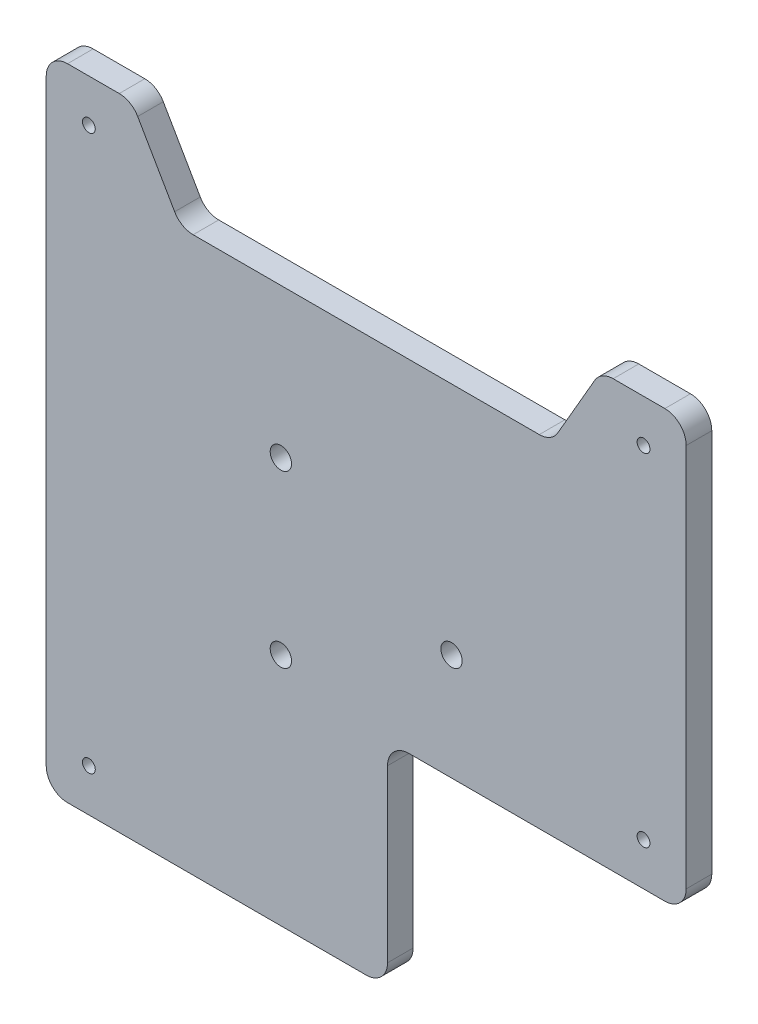
ISO-10303-21;
HEADER;
FILE_DESCRIPTION(('STEP AP214'),'2;1');
FILE_NAME('part.step','',(''),(''),'','','');
FILE_SCHEMA(('AUTOMOTIVE_DESIGN { 1 0 10303 214 1 1 1 1 }'));
ENDSEC;
DATA;
#1=APPLICATION_CONTEXT('core data for automotive mechanical design processes');
#2=APPLICATION_PROTOCOL_DEFINITION('international standard','automotive_design',2000,#1);
#3=PRODUCT_CONTEXT('',#1,'mechanical');
#4=PRODUCT('Part','Part','',(#3));
#5=PRODUCT_RELATED_PRODUCT_CATEGORY('part','',(#4));
#6=PRODUCT_DEFINITION_FORMATION('','',#4);
#7=PRODUCT_DEFINITION_CONTEXT('part definition',#1,'design');
#8=PRODUCT_DEFINITION('design','',#6,#7);
#9=PRODUCT_DEFINITION_SHAPE('','',#8);
#10=(LENGTH_UNIT() NAMED_UNIT(*) SI_UNIT(.MILLI.,.METRE.));
#11=(NAMED_UNIT(*) PLANE_ANGLE_UNIT() SI_UNIT($,.RADIAN.));
#12=(NAMED_UNIT(*) SI_UNIT($,.STERADIAN.) SOLID_ANGLE_UNIT());
#13=UNCERTAINTY_MEASURE_WITH_UNIT(LENGTH_MEASURE(1.E-05),#10,'distance_accuracy_value','');
#14=(GEOMETRIC_REPRESENTATION_CONTEXT(3) GLOBAL_UNCERTAINTY_ASSIGNED_CONTEXT((#13)) GLOBAL_UNIT_ASSIGNED_CONTEXT((#10,
#11,#12)) REPRESENTATION_CONTEXT('',''));
#15=CARTESIAN_POINT('',(0.,0.,0.));
#16=DIRECTION('',(0.,0.,1.));
#17=DIRECTION('',(1.,0.,0.));
#18=AXIS2_PLACEMENT_3D('',#15,#16,#17);
#19=CARTESIAN_POINT('',(-138.750118326392,120.053956834532,6.));
#20=DIRECTION('',(0.,-1.,0.));
#21=DIRECTION('',(0.,0.,-1.));
#22=AXIS2_PLACEMENT_3D('',#19,#20,#21);
#23=PLANE('',#22);
#24=DIRECTION('',(-1.,0.,0.));
#25=VECTOR('',#24,1.);
#26=CARTESIAN_POINT('',(-138.750118326392,120.053956834532,6.));
#27=LINE('',#26,#25);
#28=CARTESIAN_POINT('',(-121.63686967234,120.053956834532,6.));
#29=VERTEX_POINT('',#28);
#30=CARTESIAN_POINT('',(-133.750118326392,120.053956834532,6.));
#31=VERTEX_POINT('',#30);
#32=EDGE_CURVE('E203',#29,#31,#27,.T.);
#33=ORIENTED_EDGE('',*,*,#32,.F.);
#34=DIRECTION('',(0.,0.,1.));
#35=VECTOR('',#34,1.);
#36=CARTESIAN_POINT('',(-121.63686967234,120.053956834532,6.));
#37=LINE('',#36,#35);
#38=CARTESIAN_POINT('',(-121.63686967234,120.053956834532,0.));
#39=VERTEX_POINT('',#38);
#40=EDGE_CURVE('E250',#29,#39,#37,.F.);
#41=ORIENTED_EDGE('',*,*,#40,.T.);
#42=DIRECTION('',(-1.,0.,0.));
#43=VECTOR('',#42,1.);
#44=CARTESIAN_POINT('',(-138.750118326392,120.053956834532,0.));
#45=LINE('',#44,#43);
#46=CARTESIAN_POINT('',(-133.750118326392,120.053956834532,0.));
#47=VERTEX_POINT('',#46);
#48=EDGE_CURVE('E348',#39,#47,#45,.T.);
#49=ORIENTED_EDGE('',*,*,#48,.T.);
#50=DIRECTION('',(0.,0.,-1.));
#51=VECTOR('',#50,1.);
#52=CARTESIAN_POINT('',(-133.750118326392,120.053956834532,6.));
#53=LINE('',#52,#51);
#54=EDGE_CURVE('E248',#47,#31,#53,.F.);
#55=ORIENTED_EDGE('',*,*,#54,.T.);
#56=EDGE_LOOP('',(#33,#41,#49,#55));
#57=FACE_BOUND('',#56,.T.);
#58=ADVANCED_FACE('F35',(#57),#23,.F.);
#59=CARTESIAN_POINT('',(0.,0.,6.));
#60=DIRECTION('',(0.,0.,1.));
#61=DIRECTION('',(1.,0.,0.));
#62=AXIS2_PLACEMENT_3D('',#59,#60,#61);
#63=PLANE('',#62);
#64=CARTESIAN_POINT('',(-128.750118326392,-19.9460431654677,6.));
#65=DIRECTION('',(0.,0.,1.));
#66=DIRECTION('',(1.,0.,0.));
#67=AXIS2_PLACEMENT_3D('',#64,#65,#66);
#68=CIRCLE('',#67,1.5);
#69=CARTESIAN_POINT('',(-127.250118326392,-19.9460431654677,6.));
#70=VERTEX_POINT('',#69);
#71=EDGE_CURVE('E535',#70,#70,#68,.T.);
#72=ORIENTED_EDGE('',*,*,#71,.F.);
#73=EDGE_LOOP('',(#72));
#74=FACE_BOUND('',#73,.T.);
#75=CARTESIAN_POINT('',(-128.750118326392,110.053956834532,6.));
#76=DIRECTION('',(0.,0.,1.));
#77=DIRECTION('',(1.,0.,0.));
#78=AXIS2_PLACEMENT_3D('',#75,#76,#77);
#79=CIRCLE('',#78,1.5);
#80=CARTESIAN_POINT('',(-127.250118326392,110.053956834532,6.));
#81=VERTEX_POINT('',#80);
#82=EDGE_CURVE('E530',#81,#81,#79,.T.);
#83=ORIENTED_EDGE('',*,*,#82,.F.);
#84=EDGE_LOOP('',(#83));
#85=FACE_BOUND('',#84,.T.);
#86=CARTESIAN_POINT('',(1.24988167360846,30.0539568345323,6.));
#87=DIRECTION('',(0.,0.,1.));
#88=DIRECTION('',(1.,0.,0.));
#89=AXIS2_PLACEMENT_3D('',#86,#87,#88);
#90=CIRCLE('',#89,1.5);
#91=CARTESIAN_POINT('',(2.74988167360846,30.0539568345323,6.));
#92=VERTEX_POINT('',#91);
#93=EDGE_CURVE('E526',#92,#92,#90,.T.);
#94=ORIENTED_EDGE('',*,*,#93,.F.);
#95=EDGE_LOOP('',(#94));
#96=FACE_BOUND('',#95,.T.);
#97=CARTESIAN_POINT('',(1.24988167360845,110.053956834532,6.));
#98=DIRECTION('',(0.,0.,1.));
#99=DIRECTION('',(1.,0.,0.));
#100=AXIS2_PLACEMENT_3D('',#97,#98,#99);
#101=CIRCLE('',#100,1.5);
#102=CARTESIAN_POINT('',(2.74988167360845,110.053956834532,6.));
#103=VERTEX_POINT('',#102);
#104=EDGE_CURVE('E479',#103,#103,#101,.T.);
#105=ORIENTED_EDGE('',*,*,#104,.F.);
#106=EDGE_LOOP('',(#105));
#107=FACE_BOUND('',#106,.T.);
#108=DIRECTION('',(1.,0.,0.));
#109=VECTOR('',#108,1.);
#110=CARTESIAN_POINT('',(-138.750118326392,-29.9460431654677,6.));
#111=LINE('',#110,#109);
#112=CARTESIAN_POINT('',(-133.750118326392,-29.9460431654677,6.));
#113=VERTEX_POINT('',#112);
#114=CARTESIAN_POINT('',(-63.7501183263915,-29.9460431654677,6.));
#115=VERTEX_POINT('',#114);
#116=EDGE_CURVE('E191',#113,#115,#111,.T.);
#117=ORIENTED_EDGE('',*,*,#116,.T.);
#118=CARTESIAN_POINT('',(-63.7501183263915,-24.9460431654677,6.));
#119=DIRECTION('',(0.,0.,1.));
#120=DIRECTION('',(1.,0.,0.));
#121=AXIS2_PLACEMENT_3D('',#118,#119,#120);
#122=CIRCLE('',#121,5.);
#123=CARTESIAN_POINT('',(-58.7501183263915,-24.9460431654676,6.));
#124=VERTEX_POINT('',#123);
#125=EDGE_CURVE('E222',#115,#124,#122,.T.);
#126=ORIENTED_EDGE('',*,*,#125,.T.);
#127=DIRECTION('',(0.,-1.,0.));
#128=VECTOR('',#127,1.);
#129=CARTESIAN_POINT('',(-58.7501183263916,20.0539568345323,6.));
#130=LINE('',#129,#128);
#131=CARTESIAN_POINT('',(-58.7501183263916,15.0539568345323,6.));
#132=VERTEX_POINT('',#131);
#133=EDGE_CURVE('E478',#132,#124,#130,.T.);
#134=ORIENTED_EDGE('',*,*,#133,.F.);
#135=CARTESIAN_POINT('',(-53.7501183263916,15.0539568345323,6.00000000000001));
#136=DIRECTION('',(0.,0.,1.));
#137=DIRECTION('',(1.,0.,0.));
#138=AXIS2_PLACEMENT_3D('',#135,#136,#137);
#139=CIRCLE('',#138,5.);
#140=CARTESIAN_POINT('',(-53.7501183263916,20.0539568345323,6.));
#141=VERTEX_POINT('',#140);
#142=EDGE_CURVE('E275',#132,#141,#139,.F.);
#143=ORIENTED_EDGE('',*,*,#142,.T.);
#144=DIRECTION('',(-1.,0.,0.));
#145=VECTOR('',#144,1.);
#146=CARTESIAN_POINT('',(-58.7501183263916,20.0539568345323,6.));
#147=LINE('',#146,#145);
#148=CARTESIAN_POINT('',(6.24988167360846,20.0539568345323,6.));
#149=VERTEX_POINT('',#148);
#150=EDGE_CURVE('E482',#149,#141,#147,.T.);
#151=ORIENTED_EDGE('',*,*,#150,.F.);
#152=CARTESIAN_POINT('',(6.24988167360846,25.0539568345323,6.00000000000001));
#153=DIRECTION('',(0.,0.,1.));
#154=DIRECTION('',(1.,0.,0.));
#155=AXIS2_PLACEMENT_3D('',#152,#153,#154);
#156=CIRCLE('',#155,5.);
#157=CARTESIAN_POINT('',(11.2498816736085,25.0539568345323,6.));
#158=VERTEX_POINT('',#157);
#159=EDGE_CURVE('E216',#149,#158,#156,.T.);
#160=ORIENTED_EDGE('',*,*,#159,.T.);
#161=DIRECTION('',(0.,1.,0.));
#162=VECTOR('',#161,1.);
#163=CARTESIAN_POINT('',(11.2498816736084,120.053956834532,6.));
#164=LINE('',#163,#162);
#165=CARTESIAN_POINT('',(11.2498816736084,115.053956834532,6.));
#166=VERTEX_POINT('',#165);
#167=EDGE_CURVE('E199',#158,#166,#164,.T.);
#168=ORIENTED_EDGE('',*,*,#167,.T.);
#169=CARTESIAN_POINT('',(6.24988167360843,115.053956834532,6.));
#170=DIRECTION('',(0.,0.,1.));
#171=DIRECTION('',(1.,0.,0.));
#172=AXIS2_PLACEMENT_3D('',#169,#170,#171);
#173=CIRCLE('',#172,5.);
#174=CARTESIAN_POINT('',(6.24988167360843,120.053956834532,6.));
#175=VERTEX_POINT('',#174);
#176=EDGE_CURVE('E212',#166,#175,#173,.T.);
#177=ORIENTED_EDGE('',*,*,#176,.T.);
#178=CARTESIAN_POINT('',(-5.8633669804434,120.053956834532,6.));
#179=VERTEX_POINT('',#178);
#180=EDGE_CURVE('E343',#175,#179,#27,.T.);
#181=ORIENTED_EDGE('',*,*,#180,.T.);
#182=CARTESIAN_POINT('',(-5.8633669804434,115.053956834532,6.));
#183=DIRECTION('',(0.,0.,1.));
#184=DIRECTION('',(1.,0.,0.));
#185=AXIS2_PLACEMENT_3D('',#182,#183,#184);
#186=CIRCLE('',#185,5.);
#187=CARTESIAN_POINT('',(-10.1934939993656,117.553956834532,6.));
#188=VERTEX_POINT('',#187);
#189=EDGE_CURVE('E218',#179,#188,#186,.T.);
#190=ORIENTED_EDGE('',*,*,#189,.T.);
#191=DIRECTION('',(0.499999999999994,0.866025403784442,0.));
#192=VECTOR('',#191,1.);
#193=CARTESIAN_POINT('',(-8.75011832639156,120.053956834532,6.));
#194=LINE('',#193,#192);
#195=CARTESIAN_POINT('',(-18.8537480372099,102.553956834532,6.));
#196=VERTEX_POINT('',#195);
#197=EDGE_CURVE('E300',#196,#188,#194,.T.);
#198=ORIENTED_EDGE('',*,*,#197,.F.);
#199=CARTESIAN_POINT('',(-23.1838750561321,105.053956834532,6.00000000000001));
#200=DIRECTION('',(0.,0.,1.));
#201=DIRECTION('',(1.,0.,0.));
#202=AXIS2_PLACEMENT_3D('',#199,#200,#201);
#203=CIRCLE('',#202,5.);
#204=CARTESIAN_POINT('',(-23.1838750561321,100.053956834532,6.));
#205=VERTEX_POINT('',#204);
#206=EDGE_CURVE('E279',#196,#205,#203,.F.);
#207=ORIENTED_EDGE('',*,*,#206,.T.);
#208=DIRECTION('',(1.,0.,0.));
#209=VECTOR('',#208,1.);
#210=CARTESIAN_POINT('',(-20.2971237101839,100.053956834532,6.));
#211=LINE('',#210,#209);
#212=CARTESIAN_POINT('',(-104.316361596651,100.053956834532,6.));
#213=VERTEX_POINT('',#212);
#214=EDGE_CURVE('E290',#213,#205,#211,.T.);
#215=ORIENTED_EDGE('',*,*,#214,.F.);
#216=CARTESIAN_POINT('',(-104.316361596651,105.053956834532,6.00000000000001));
#217=DIRECTION('',(0.,0.,1.));
#218=DIRECTION('',(1.,0.,0.));
#219=AXIS2_PLACEMENT_3D('',#216,#217,#218);
#220=CIRCLE('',#219,5.);
#221=CARTESIAN_POINT('',(-108.646488615573,102.553956834532,6.));
#222=VERTEX_POINT('',#221);
#223=EDGE_CURVE('E43',#213,#222,#220,.F.);
#224=ORIENTED_EDGE('',*,*,#223,.T.);
#225=DIRECTION('',(0.500000000000001,-0.866025403784438,0.));
#226=VECTOR('',#225,1.);
#227=CARTESIAN_POINT('',(-118.750118326392,120.053956834532,6.));
#228=LINE('',#227,#226);
#229=CARTESIAN_POINT('',(-117.306742653417,117.553956834532,6.));
#230=VERTEX_POINT('',#229);
#231=EDGE_CURVE('E288',#230,#222,#228,.T.);
#232=ORIENTED_EDGE('',*,*,#231,.F.);
#233=CARTESIAN_POINT('',(-121.63686967234,115.053956834532,6.00000000000001));
#234=DIRECTION('',(0.,0.,1.));
#235=DIRECTION('',(1.,0.,0.));
#236=AXIS2_PLACEMENT_3D('',#233,#234,#235);
#237=CIRCLE('',#236,5.);
#238=EDGE_CURVE('E220',#230,#29,#237,.T.);
#239=ORIENTED_EDGE('',*,*,#238,.T.);
#240=ORIENTED_EDGE('',*,*,#32,.T.);
#241=CARTESIAN_POINT('',(-133.750118326392,115.053956834532,6.));
#242=DIRECTION('',(0.,0.,1.));
#243=DIRECTION('',(1.,0.,0.));
#244=AXIS2_PLACEMENT_3D('',#241,#242,#243);
#245=CIRCLE('',#244,5.);
#246=CARTESIAN_POINT('',(-138.750118326392,115.053956834532,6.));
#247=VERTEX_POINT('',#246);
#248=EDGE_CURVE('E210',#31,#247,#245,.T.);
#249=ORIENTED_EDGE('',*,*,#248,.T.);
#250=DIRECTION('',(0.,-1.,0.));
#251=VECTOR('',#250,1.);
#252=CARTESIAN_POINT('',(-138.750118326392,120.053956834532,6.));
#253=LINE('',#252,#251);
#254=CARTESIAN_POINT('',(-138.750118326392,-24.9460431654677,6.));
#255=VERTEX_POINT('',#254);
#256=EDGE_CURVE('E344',#247,#255,#253,.T.);
#257=ORIENTED_EDGE('',*,*,#256,.T.);
#258=CARTESIAN_POINT('',(-133.750118326392,-24.9460431654677,6.));
#259=DIRECTION('',(0.,0.,1.));
#260=DIRECTION('',(1.,0.,0.));
#261=AXIS2_PLACEMENT_3D('',#258,#259,#260);
#262=CIRCLE('',#261,5.);
#263=EDGE_CURVE('E214',#255,#113,#262,.T.);
#264=ORIENTED_EDGE('',*,*,#263,.T.);
#265=EDGE_LOOP('',(#117,#126,#134,#143,#151,#160,#168,#177,#181,#190,#198,#207,#215,#224,#232,
#239,#240,#249,#257,#264));
#266=FACE_BOUND('',#265,.T.);
#267=CARTESIAN_POINT('',(-43.7501183263915,45.0539568345324,6.));
#268=DIRECTION('',(0.,0.,1.));
#269=DIRECTION('',(1.,0.,0.));
#270=AXIS2_PLACEMENT_3D('',#267,#268,#269);
#271=CIRCLE('',#270,2.5);
#272=CARTESIAN_POINT('',(-41.2501183263915,45.0539568345324,6.));
#273=VERTEX_POINT('',#272);
#274=EDGE_CURVE('E329',#273,#273,#271,.T.);
#275=ORIENTED_EDGE('',*,*,#274,.F.);
#276=EDGE_LOOP('',(#275));
#277=FACE_BOUND('',#276,.T.);
#278=CARTESIAN_POINT('',(-83.7501183263915,65.0539568345324,6.));
#279=DIRECTION('',(0.,0.,1.));
#280=DIRECTION('',(1.,0.,0.));
#281=AXIS2_PLACEMENT_3D('',#278,#279,#280);
#282=CIRCLE('',#281,2.5);
#283=CARTESIAN_POINT('',(-81.2501183263915,65.0539568345324,6.));
#284=VERTEX_POINT('',#283);
#285=EDGE_CURVE('E335',#284,#284,#282,.T.);
#286=ORIENTED_EDGE('',*,*,#285,.F.);
#287=EDGE_LOOP('',(#286));
#288=FACE_BOUND('',#287,.T.);
#289=CARTESIAN_POINT('',(-83.7501183263915,25.0539568345323,6.));
#290=DIRECTION('',(0.,0.,1.));
#291=DIRECTION('',(1.,0.,0.));
#292=AXIS2_PLACEMENT_3D('',#289,#290,#291);
#293=CIRCLE('',#292,2.50000000000001);
#294=CARTESIAN_POINT('',(-81.2501183263915,25.0539568345323,6.));
#295=VERTEX_POINT('',#294);
#296=EDGE_CURVE('E323',#295,#295,#293,.T.);
#297=ORIENTED_EDGE('',*,*,#296,.F.);
#298=EDGE_LOOP('',(#297));
#299=FACE_BOUND('',#298,.T.);
#300=ADVANCED_FACE('F286',(#74,#85,#96,#107,#266,#277,#288,#299),#63,.T.);
#301=CARTESIAN_POINT('',(0.,0.,0.));
#302=DIRECTION('',(0.,0.,1.));
#303=DIRECTION('',(1.,0.,0.));
#304=AXIS2_PLACEMENT_3D('',#301,#302,#303);
#305=PLANE('',#304);
#306=CARTESIAN_POINT('',(-128.750118326392,-19.9460431654677,0.));
#307=DIRECTION('',(0.,0.,1.));
#308=DIRECTION('',(1.,0.,0.));
#309=AXIS2_PLACEMENT_3D('',#306,#307,#308);
#310=CIRCLE('',#309,1.5);
#311=CARTESIAN_POINT('',(-127.250118326392,-19.9460431654677,0.));
#312=VERTEX_POINT('',#311);
#313=EDGE_CURVE('E465',#312,#312,#310,.F.);
#314=ORIENTED_EDGE('',*,*,#313,.F.);
#315=EDGE_LOOP('',(#314));
#316=FACE_BOUND('',#315,.T.);
#317=CARTESIAN_POINT('',(-128.750118326392,110.053956834532,0.));
#318=DIRECTION('',(0.,0.,1.));
#319=DIRECTION('',(1.,0.,0.));
#320=AXIS2_PLACEMENT_3D('',#317,#318,#319);
#321=CIRCLE('',#320,1.5);
#322=CARTESIAN_POINT('',(-127.250118326392,110.053956834532,0.));
#323=VERTEX_POINT('',#322);
#324=EDGE_CURVE('E469',#323,#323,#321,.F.);
#325=ORIENTED_EDGE('',*,*,#324,.F.);
#326=EDGE_LOOP('',(#325));
#327=FACE_BOUND('',#326,.T.);
#328=CARTESIAN_POINT('',(1.24988167360846,30.0539568345323,0.));
#329=DIRECTION('',(0.,0.,1.));
#330=DIRECTION('',(1.,0.,0.));
#331=AXIS2_PLACEMENT_3D('',#328,#329,#330);
#332=CIRCLE('',#331,1.5);
#333=CARTESIAN_POINT('',(2.74988167360846,30.0539568345323,0.));
#334=VERTEX_POINT('',#333);
#335=EDGE_CURVE('E473',#334,#334,#332,.F.);
#336=ORIENTED_EDGE('',*,*,#335,.F.);
#337=EDGE_LOOP('',(#336));
#338=FACE_BOUND('',#337,.T.);
#339=CARTESIAN_POINT('',(1.24988167360845,110.053956834532,0.));
#340=DIRECTION('',(0.,0.,1.));
#341=DIRECTION('',(1.,0.,0.));
#342=AXIS2_PLACEMENT_3D('',#339,#340,#341);
#343=CIRCLE('',#342,1.5);
#344=CARTESIAN_POINT('',(2.74988167360845,110.053956834532,0.));
#345=VERTEX_POINT('',#344);
#346=EDGE_CURVE('E476',#345,#345,#343,.F.);
#347=ORIENTED_EDGE('',*,*,#346,.F.);
#348=EDGE_LOOP('',(#347));
#349=FACE_BOUND('',#348,.T.);
#350=DIRECTION('',(0.,1.,0.));
#351=VECTOR('',#350,1.);
#352=CARTESIAN_POINT('',(-58.7501183263916,20.0539568345323,0.));
#353=LINE('',#352,#351);
#354=CARTESIAN_POINT('',(-58.7501183263915,-24.9460431654676,0.));
#355=VERTEX_POINT('',#354);
#356=CARTESIAN_POINT('',(-58.7501183263916,15.0539568345323,0.));
#357=VERTEX_POINT('',#356);
#358=EDGE_CURVE('E320',#355,#357,#353,.T.);
#359=ORIENTED_EDGE('',*,*,#358,.F.);
#360=CARTESIAN_POINT('',(-63.7501183263915,-24.9460431654677,0.));
#361=DIRECTION('',(0.,0.,1.));
#362=DIRECTION('',(1.,0.,0.));
#363=AXIS2_PLACEMENT_3D('',#360,#361,#362);
#364=CIRCLE('',#363,5.);
#365=CARTESIAN_POINT('',(-63.7501183263915,-29.9460431654677,0.));
#366=VERTEX_POINT('',#365);
#367=EDGE_CURVE('E198',#355,#366,#364,.F.);
#368=ORIENTED_EDGE('',*,*,#367,.T.);
#369=DIRECTION('',(1.,0.,0.));
#370=VECTOR('',#369,1.);
#371=CARTESIAN_POINT('',(-138.750118326392,-29.9460431654677,0.));
#372=LINE('',#371,#370);
#373=CARTESIAN_POINT('',(-133.750118326392,-29.9460431654677,0.));
#374=VERTEX_POINT('',#373);
#375=EDGE_CURVE('E188',#374,#366,#372,.T.);
#376=ORIENTED_EDGE('',*,*,#375,.F.);
#377=CARTESIAN_POINT('',(-133.750118326392,-24.9460431654677,0.));
#378=DIRECTION('',(0.,0.,1.));
#379=DIRECTION('',(1.,0.,0.));
#380=AXIS2_PLACEMENT_3D('',#377,#378,#379);
#381=CIRCLE('',#380,5.);
#382=CARTESIAN_POINT('',(-138.750118326392,-24.9460431654677,0.));
#383=VERTEX_POINT('',#382);
#384=EDGE_CURVE('E172',#374,#383,#381,.F.);
#385=ORIENTED_EDGE('',*,*,#384,.T.);
#386=DIRECTION('',(0.,-1.,0.));
#387=VECTOR('',#386,1.);
#388=CARTESIAN_POINT('',(-138.750118326392,120.053956834532,0.));
#389=LINE('',#388,#387);
#390=CARTESIAN_POINT('',(-138.750118326392,115.053956834532,0.));
#391=VERTEX_POINT('',#390);
#392=EDGE_CURVE('E200',#391,#383,#389,.T.);
#393=ORIENTED_EDGE('',*,*,#392,.F.);
#394=CARTESIAN_POINT('',(-133.750118326392,115.053956834532,0.));
#395=DIRECTION('',(0.,0.,1.));
#396=DIRECTION('',(1.,0.,0.));
#397=AXIS2_PLACEMENT_3D('',#394,#395,#396);
#398=CIRCLE('',#397,5.);
#399=EDGE_CURVE('E229',#391,#47,#398,.F.);
#400=ORIENTED_EDGE('',*,*,#399,.T.);
#401=ORIENTED_EDGE('',*,*,#48,.F.);
#402=CARTESIAN_POINT('',(-121.63686967234,115.053956834532,0.));
#403=DIRECTION('',(0.,0.,1.));
#404=DIRECTION('',(1.,0.,0.));
#405=AXIS2_PLACEMENT_3D('',#402,#403,#404);
#406=CIRCLE('',#405,5.);
#407=CARTESIAN_POINT('',(-117.306742653417,117.553956834532,0.));
#408=VERTEX_POINT('',#407);
#409=EDGE_CURVE('E235',#39,#408,#406,.F.);
#410=ORIENTED_EDGE('',*,*,#409,.T.);
#411=DIRECTION('',(-0.500000000000001,0.866025403784438,0.));
#412=VECTOR('',#411,1.);
#413=CARTESIAN_POINT('',(-118.750118326392,120.053956834532,0.));
#414=LINE('',#413,#412);
#415=CARTESIAN_POINT('',(-108.646488615573,102.553956834532,0.));
#416=VERTEX_POINT('',#415);
#417=EDGE_CURVE('E299',#416,#408,#414,.T.);
#418=ORIENTED_EDGE('',*,*,#417,.F.);
#419=CARTESIAN_POINT('',(-104.316361596651,105.053956834532,0.));
#420=DIRECTION('',(0.,0.,1.));
#421=DIRECTION('',(1.,0.,0.));
#422=AXIS2_PLACEMENT_3D('',#419,#420,#421);
#423=CIRCLE('',#422,5.);
#424=CARTESIAN_POINT('',(-104.316361596651,100.053956834532,0.));
#425=VERTEX_POINT('',#424);
#426=EDGE_CURVE('E11',#416,#425,#423,.T.);
#427=ORIENTED_EDGE('',*,*,#426,.T.);
#428=DIRECTION('',(-1.,0.,0.));
#429=VECTOR('',#428,1.);
#430=CARTESIAN_POINT('',(-20.2971237101839,100.053956834532,0.));
#431=LINE('',#430,#429);
#432=CARTESIAN_POINT('',(-23.1838750561321,100.053956834532,0.));
#433=VERTEX_POINT('',#432);
#434=EDGE_CURVE('E306',#433,#425,#431,.T.);
#435=ORIENTED_EDGE('',*,*,#434,.F.);
#436=CARTESIAN_POINT('',(-23.1838750561321,105.053956834532,0.));
#437=DIRECTION('',(0.,0.,1.));
#438=DIRECTION('',(1.,0.,0.));
#439=AXIS2_PLACEMENT_3D('',#436,#437,#438);
#440=CIRCLE('',#439,5.);
#441=CARTESIAN_POINT('',(-18.8537480372099,102.553956834532,0.));
#442=VERTEX_POINT('',#441);
#443=EDGE_CURVE('E281',#433,#442,#440,.T.);
#444=ORIENTED_EDGE('',*,*,#443,.T.);
#445=DIRECTION('',(-0.499999999999995,-0.866025403784442,0.));
#446=VECTOR('',#445,1.);
#447=CARTESIAN_POINT('',(-8.75011832639156,120.053956834532,0.));
#448=LINE('',#447,#446);
#449=CARTESIAN_POINT('',(-10.1934939993656,117.553956834532,0.));
#450=VERTEX_POINT('',#449);
#451=EDGE_CURVE('E311',#450,#442,#448,.T.);
#452=ORIENTED_EDGE('',*,*,#451,.F.);
#453=CARTESIAN_POINT('',(-5.8633669804434,115.053956834532,0.));
#454=DIRECTION('',(0.,0.,1.));
#455=DIRECTION('',(1.,0.,0.));
#456=AXIS2_PLACEMENT_3D('',#453,#454,#455);
#457=CIRCLE('',#456,5.);
#458=CARTESIAN_POINT('',(-5.8633669804434,120.053956834532,0.));
#459=VERTEX_POINT('',#458);
#460=EDGE_CURVE('E233',#450,#459,#457,.F.);
#461=ORIENTED_EDGE('',*,*,#460,.T.);
#462=CARTESIAN_POINT('',(6.24988167360843,120.053956834532,0.));
#463=VERTEX_POINT('',#462);
#464=EDGE_CURVE('E205',#463,#459,#45,.T.);
#465=ORIENTED_EDGE('',*,*,#464,.F.);
#466=CARTESIAN_POINT('',(6.24988167360843,115.053956834532,0.));
#467=DIRECTION('',(0.,0.,1.));
#468=DIRECTION('',(1.,0.,0.));
#469=AXIS2_PLACEMENT_3D('',#466,#467,#468);
#470=CIRCLE('',#469,5.);
#471=CARTESIAN_POINT('',(11.2498816736084,115.053956834532,0.));
#472=VERTEX_POINT('',#471);
#473=EDGE_CURVE('E50',#463,#472,#470,.F.);
#474=ORIENTED_EDGE('',*,*,#473,.T.);
#475=DIRECTION('',(0.,1.,0.));
#476=VECTOR('',#475,1.);
#477=CARTESIAN_POINT('',(11.2498816736084,120.053956834532,0.));
#478=LINE('',#477,#476);
#479=CARTESIAN_POINT('',(11.2498816736085,25.0539568345323,0.));
#480=VERTEX_POINT('',#479);
#481=EDGE_CURVE('E338',#480,#472,#478,.T.);
#482=ORIENTED_EDGE('',*,*,#481,.F.);
#483=CARTESIAN_POINT('',(6.24988167360846,25.0539568345323,0.));
#484=DIRECTION('',(0.,0.,1.));
#485=DIRECTION('',(1.,0.,0.));
#486=AXIS2_PLACEMENT_3D('',#483,#484,#485);
#487=CIRCLE('',#486,5.);
#488=CARTESIAN_POINT('',(6.24988167360846,20.0539568345323,0.));
#489=VERTEX_POINT('',#488);
#490=EDGE_CURVE('E181',#480,#489,#487,.F.);
#491=ORIENTED_EDGE('',*,*,#490,.T.);
#492=DIRECTION('',(1.,0.,0.));
#493=VECTOR('',#492,1.);
#494=CARTESIAN_POINT('',(-58.7501183263916,20.0539568345323,0.));
#495=LINE('',#494,#493);
#496=CARTESIAN_POINT('',(-53.7501183263916,20.0539568345323,0.));
#497=VERTEX_POINT('',#496);
#498=EDGE_CURVE('E488',#497,#489,#495,.T.);
#499=ORIENTED_EDGE('',*,*,#498,.F.);
#500=CARTESIAN_POINT('',(-53.7501183263916,15.0539568345323,0.));
#501=DIRECTION('',(0.,0.,1.));
#502=DIRECTION('',(1.,0.,0.));
#503=AXIS2_PLACEMENT_3D('',#500,#501,#502);
#504=CIRCLE('',#503,5.);
#505=EDGE_CURVE('E277',#497,#357,#504,.T.);
#506=ORIENTED_EDGE('',*,*,#505,.T.);
#507=EDGE_LOOP('',(#359,#368,#376,#385,#393,#400,#401,#410,#418,#427,#435,#444,#452,#461,#465,
#474,#482,#491,#499,#506));
#508=FACE_BOUND('',#507,.T.);
#509=CARTESIAN_POINT('',(-83.7501183263915,65.0539568345324,0.));
#510=DIRECTION('',(0.,0.,1.));
#511=DIRECTION('',(1.,0.,0.));
#512=AXIS2_PLACEMENT_3D('',#509,#510,#511);
#513=CIRCLE('',#512,2.5);
#514=CARTESIAN_POINT('',(-81.2501183263915,65.0539568345324,0.));
#515=VERTEX_POINT('',#514);
#516=EDGE_CURVE('E332',#515,#515,#513,.T.);
#517=ORIENTED_EDGE('',*,*,#516,.T.);
#518=EDGE_LOOP('',(#517));
#519=FACE_BOUND('',#518,.T.);
#520=CARTESIAN_POINT('',(-43.7501183263915,45.0539568345324,0.));
#521=DIRECTION('',(0.,0.,1.));
#522=DIRECTION('',(1.,0.,0.));
#523=AXIS2_PLACEMENT_3D('',#520,#521,#522);
#524=CIRCLE('',#523,2.5);
#525=CARTESIAN_POINT('',(-41.2501183263915,45.0539568345324,0.));
#526=VERTEX_POINT('',#525);
#527=EDGE_CURVE('E326',#526,#526,#524,.T.);
#528=ORIENTED_EDGE('',*,*,#527,.T.);
#529=EDGE_LOOP('',(#528));
#530=FACE_BOUND('',#529,.T.);
#531=CARTESIAN_POINT('',(-83.7501183263915,25.0539568345323,0.));
#532=DIRECTION('',(0.,0.,1.));
#533=DIRECTION('',(1.,0.,0.));
#534=AXIS2_PLACEMENT_3D('',#531,#532,#533);
#535=CIRCLE('',#534,2.50000000000001);
#536=CARTESIAN_POINT('',(-81.2501183263915,25.0539568345323,0.));
#537=VERTEX_POINT('',#536);
#538=EDGE_CURVE('E314',#537,#537,#535,.T.);
#539=ORIENTED_EDGE('',*,*,#538,.T.);
#540=EDGE_LOOP('',(#539));
#541=FACE_BOUND('',#540,.T.);
#542=ADVANCED_FACE('F195',(#316,#327,#338,#349,#508,#519,#530,#541),#305,.F.);
#543=CARTESIAN_POINT('',(11.2498816736084,120.053956834532,6.));
#544=DIRECTION('',(-1.,0.,0.));
#545=DIRECTION('',(0.,-1.,0.));
#546=AXIS2_PLACEMENT_3D('',#543,#544,#545);
#547=PLANE('',#546);
#548=ORIENTED_EDGE('',*,*,#167,.F.);
#549=DIRECTION('',(0.,0.,1.));
#550=VECTOR('',#549,1.);
#551=CARTESIAN_POINT('',(11.2498816736085,25.0539568345323,6.));
#552=LINE('',#551,#550);
#553=EDGE_CURVE('E57',#158,#480,#552,.F.);
#554=ORIENTED_EDGE('',*,*,#553,.T.);
#555=ORIENTED_EDGE('',*,*,#481,.T.);
#556=DIRECTION('',(0.,0.,-1.));
#557=VECTOR('',#556,1.);
#558=CARTESIAN_POINT('',(11.2498816736084,115.053956834532,6.));
#559=LINE('',#558,#557);
#560=EDGE_CURVE('E268',#472,#166,#559,.F.);
#561=ORIENTED_EDGE('',*,*,#560,.T.);
#562=EDGE_LOOP('',(#548,#554,#555,#561));
#563=FACE_BOUND('',#562,.T.);
#564=ADVANCED_FACE('F374',(#563),#547,.F.);
#565=ORIENTED_EDGE('',*,*,#464,.T.);
#566=DIRECTION('',(0.,0.,1.));
#567=VECTOR('',#566,1.);
#568=CARTESIAN_POINT('',(-5.8633669804434,120.053956834532,6.));
#569=LINE('',#568,#567);
#570=EDGE_CURVE('E265',#459,#179,#569,.T.);
#571=ORIENTED_EDGE('',*,*,#570,.T.);
#572=ORIENTED_EDGE('',*,*,#180,.F.);
#573=DIRECTION('',(0.,0.,-1.));
#574=VECTOR('',#573,1.);
#575=CARTESIAN_POINT('',(6.24988167360843,120.053956834532,6.));
#576=LINE('',#575,#574);
#577=EDGE_CURVE('E262',#175,#463,#576,.T.);
#578=ORIENTED_EDGE('',*,*,#577,.T.);
#579=EDGE_LOOP('',(#565,#571,#572,#578));
#580=FACE_BOUND('',#579,.T.);
#581=ADVANCED_FACE('F366',(#580),#23,.F.);
#582=CARTESIAN_POINT('',(-138.750118326392,120.053956834532,6.));
#583=DIRECTION('',(1.,0.,0.));
#584=DIRECTION('',(0.,1.,0.));
#585=AXIS2_PLACEMENT_3D('',#582,#583,#584);
#586=PLANE('',#585);
#587=ORIENTED_EDGE('',*,*,#392,.T.);
#588=DIRECTION('',(0.,0.,-1.));
#589=VECTOR('',#588,1.);
#590=CARTESIAN_POINT('',(-138.750118326392,-24.9460431654677,6.));
#591=LINE('',#590,#589);
#592=EDGE_CURVE('E177',#383,#255,#591,.F.);
#593=ORIENTED_EDGE('',*,*,#592,.T.);
#594=ORIENTED_EDGE('',*,*,#256,.F.);
#595=DIRECTION('',(0.,0.,-1.));
#596=VECTOR('',#595,1.);
#597=CARTESIAN_POINT('',(-138.750118326392,115.053956834532,6.));
#598=LINE('',#597,#596);
#599=EDGE_CURVE('E271',#247,#391,#598,.T.);
#600=ORIENTED_EDGE('',*,*,#599,.T.);
#601=EDGE_LOOP('',(#587,#593,#594,#600));
#602=FACE_BOUND('',#601,.T.);
#603=ADVANCED_FACE('F364',(#602),#586,.F.);
#604=CARTESIAN_POINT('',(-138.750118326392,-29.9460431654677,6.));
#605=DIRECTION('',(0.,1.,0.));
#606=DIRECTION('',(0.,0.,1.));
#607=AXIS2_PLACEMENT_3D('',#604,#605,#606);
#608=PLANE('',#607);
#609=ORIENTED_EDGE('',*,*,#375,.T.);
#610=DIRECTION('',(0.,0.,1.));
#611=VECTOR('',#610,1.);
#612=CARTESIAN_POINT('',(-63.7501183263915,-29.9460431654677,6.));
#613=LINE('',#612,#611);
#614=EDGE_CURVE('E192',#366,#115,#613,.T.);
#615=ORIENTED_EDGE('',*,*,#614,.T.);
#616=ORIENTED_EDGE('',*,*,#116,.F.);
#617=DIRECTION('',(0.,0.,-1.));
#618=VECTOR('',#617,1.);
#619=CARTESIAN_POINT('',(-133.750118326392,-29.9460431654677,6.));
#620=LINE('',#619,#618);
#621=EDGE_CURVE('E176',#113,#374,#620,.T.);
#622=ORIENTED_EDGE('',*,*,#621,.T.);
#623=EDGE_LOOP('',(#609,#615,#616,#622));
#624=FACE_BOUND('',#623,.T.);
#625=ADVANCED_FACE('F186',(#624),#608,.F.);
#626=CARTESIAN_POINT('',(-83.7501183263915,65.0539568345324,6.));
#627=DIRECTION('',(0.,0.,-1.));
#628=DIRECTION('',(-1.,0.,0.));
#629=AXIS2_PLACEMENT_3D('',#626,#627,#628);
#630=CYLINDRICAL_SURFACE('',#629,2.5);
#631=ORIENTED_EDGE('',*,*,#285,.T.);
#632=EDGE_LOOP('',(#631));
#633=FACE_BOUND('',#632,.T.);
#634=ORIENTED_EDGE('',*,*,#516,.F.);
#635=EDGE_LOOP('',(#634));
#636=FACE_BOUND('',#635,.T.);
#637=ADVANCED_FACE('F372',(#633,#636),#630,.F.);
#638=CARTESIAN_POINT('',(-43.7501183263915,45.0539568345324,6.));
#639=DIRECTION('',(0.,0.,-1.));
#640=DIRECTION('',(-1.,0.,0.));
#641=AXIS2_PLACEMENT_3D('',#638,#639,#640);
#642=CYLINDRICAL_SURFACE('',#641,2.5);
#643=ORIENTED_EDGE('',*,*,#274,.T.);
#644=EDGE_LOOP('',(#643));
#645=FACE_BOUND('',#644,.T.);
#646=ORIENTED_EDGE('',*,*,#527,.F.);
#647=EDGE_LOOP('',(#646));
#648=FACE_BOUND('',#647,.T.);
#649=ADVANCED_FACE('F449',(#645,#648),#642,.F.);
#650=CARTESIAN_POINT('',(-83.7501183263915,25.0539568345323,6.));
#651=DIRECTION('',(0.,0.,-1.));
#652=DIRECTION('',(-1.,0.,0.));
#653=AXIS2_PLACEMENT_3D('',#650,#651,#652);
#654=CYLINDRICAL_SURFACE('',#653,2.50000000000001);
#655=ORIENTED_EDGE('',*,*,#296,.T.);
#656=EDGE_LOOP('',(#655));
#657=FACE_BOUND('',#656,.T.);
#658=ORIENTED_EDGE('',*,*,#538,.F.);
#659=EDGE_LOOP('',(#658));
#660=FACE_BOUND('',#659,.T.);
#661=ADVANCED_FACE('F446',(#657,#660),#654,.F.);
#662=CARTESIAN_POINT('',(-20.2971237101839,100.053956834532,-111.803398874989));
#663=DIRECTION('',(0.,-1.,0.));
#664=DIRECTION('',(0.,0.,-1.));
#665=AXIS2_PLACEMENT_3D('',#662,#663,#664);
#666=PLANE('',#665);
#667=ORIENTED_EDGE('',*,*,#214,.T.);
#668=DIRECTION('',(0.,0.,1.));
#669=VECTOR('',#668,1.);
#670=CARTESIAN_POINT('',(-23.1838750561321,100.053956834532,0.));
#671=LINE('',#670,#669);
#672=EDGE_CURVE('E260',#205,#433,#671,.F.);
#673=ORIENTED_EDGE('',*,*,#672,.T.);
#674=ORIENTED_EDGE('',*,*,#434,.T.);
#675=DIRECTION('',(0.,0.,1.));
#676=VECTOR('',#675,1.);
#677=CARTESIAN_POINT('',(-104.316361596651,100.053956834532,6.00000000000001));
#678=LINE('',#677,#676);
#679=EDGE_CURVE('E257',#425,#213,#678,.T.);
#680=ORIENTED_EDGE('',*,*,#679,.T.);
#681=EDGE_LOOP('',(#667,#673,#674,#680));
#682=FACE_BOUND('',#681,.T.);
#683=ADVANCED_FACE('F309',(#682),#666,.F.);
#684=CARTESIAN_POINT('',(-118.750118326392,120.053956834532,-111.803398874989));
#685=DIRECTION('',(-0.866025403784438,-0.500000000000001,0.));
#686=DIRECTION('',(0.500000000000001,-0.866025403784438,0.));
#687=AXIS2_PLACEMENT_3D('',#684,#685,#686);
#688=PLANE('',#687);
#689=ORIENTED_EDGE('',*,*,#417,.T.);
#690=DIRECTION('',(0.,0.,1.));
#691=VECTOR('',#690,1.);
#692=CARTESIAN_POINT('',(-117.306742653417,117.553956834532,-111.803398874989));
#693=LINE('',#692,#691);
#694=EDGE_CURVE('E245',#408,#230,#693,.T.);
#695=ORIENTED_EDGE('',*,*,#694,.T.);
#696=ORIENTED_EDGE('',*,*,#231,.T.);
#697=DIRECTION('',(0.,0.,1.));
#698=VECTOR('',#697,1.);
#699=CARTESIAN_POINT('',(-108.646488615573,102.553956834532,0.));
#700=LINE('',#699,#698);
#701=EDGE_CURVE('E243',#222,#416,#700,.F.);
#702=ORIENTED_EDGE('',*,*,#701,.T.);
#703=EDGE_LOOP('',(#689,#695,#696,#702));
#704=FACE_BOUND('',#703,.T.);
#705=ADVANCED_FACE('F296',(#704),#688,.F.);
#706=CARTESIAN_POINT('',(-8.75011832639156,120.053956834532,-111.803398874989));
#707=DIRECTION('',(0.866025403784442,-0.499999999999995,0.));
#708=DIRECTION('',(0.499999999999995,0.866025403784442,0.));
#709=AXIS2_PLACEMENT_3D('',#706,#707,#708);
#710=PLANE('',#709);
#711=ORIENTED_EDGE('',*,*,#451,.T.);
#712=DIRECTION('',(0.,0.,1.));
#713=VECTOR('',#712,1.);
#714=CARTESIAN_POINT('',(-18.8537480372099,102.553956834532,6.00000000000001));
#715=LINE('',#714,#713);
#716=EDGE_CURVE('E254',#442,#196,#715,.T.);
#717=ORIENTED_EDGE('',*,*,#716,.T.);
#718=ORIENTED_EDGE('',*,*,#197,.T.);
#719=DIRECTION('',(0.,0.,1.));
#720=VECTOR('',#719,1.);
#721=CARTESIAN_POINT('',(-10.1934939993656,117.553956834532,-111.803398874989));
#722=LINE('',#721,#720);
#723=EDGE_CURVE('E252',#188,#450,#722,.F.);
#724=ORIENTED_EDGE('',*,*,#723,.T.);
#725=EDGE_LOOP('',(#711,#717,#718,#724));
#726=FACE_BOUND('',#725,.T.);
#727=ADVANCED_FACE('F430',(#726),#710,.F.);
#728=CARTESIAN_POINT('',(-58.7501183263916,20.0539568345323,-86.0232526704263));
#729=DIRECTION('',(-1.,0.,0.));
#730=DIRECTION('',(0.,-1.,0.));
#731=AXIS2_PLACEMENT_3D('',#728,#729,#730);
#732=PLANE('',#731);
#733=ORIENTED_EDGE('',*,*,#133,.T.);
#734=DIRECTION('',(0.,0.,1.));
#735=VECTOR('',#734,1.);
#736=CARTESIAN_POINT('',(-58.7501183263915,-24.9460431654676,-86.0232526704263));
#737=LINE('',#736,#735);
#738=EDGE_CURVE('E227',#124,#355,#737,.F.);
#739=ORIENTED_EDGE('',*,*,#738,.T.);
#740=ORIENTED_EDGE('',*,*,#358,.T.);
#741=DIRECTION('',(0.,0.,1.));
#742=VECTOR('',#741,1.);
#743=CARTESIAN_POINT('',(-58.7501183263916,15.0539568345323,6.00000000000001));
#744=LINE('',#743,#742);
#745=EDGE_CURVE('E224',#357,#132,#744,.T.);
#746=ORIENTED_EDGE('',*,*,#745,.T.);
#747=EDGE_LOOP('',(#733,#739,#740,#746));
#748=FACE_BOUND('',#747,.T.);
#749=ADVANCED_FACE('F434',(#748),#732,.F.);
#750=CARTESIAN_POINT('',(-58.7501183263916,20.0539568345323,-86.0232526704263));
#751=DIRECTION('',(0.,1.,0.));
#752=DIRECTION('',(-1.,0.,0.));
#753=AXIS2_PLACEMENT_3D('',#750,#751,#752);
#754=PLANE('',#753);
#755=ORIENTED_EDGE('',*,*,#150,.T.);
#756=DIRECTION('',(0.,0.,1.));
#757=VECTOR('',#756,1.);
#758=CARTESIAN_POINT('',(-53.7501183263916,20.0539568345323,0.));
#759=LINE('',#758,#757);
#760=EDGE_CURVE('E241',#141,#497,#759,.F.);
#761=ORIENTED_EDGE('',*,*,#760,.T.);
#762=ORIENTED_EDGE('',*,*,#498,.T.);
#763=DIRECTION('',(0.,0.,1.));
#764=VECTOR('',#763,1.);
#765=CARTESIAN_POINT('',(6.24988167360846,20.0539568345323,-86.0232526704263));
#766=LINE('',#765,#764);
#767=EDGE_CURVE('E238',#489,#149,#766,.T.);
#768=ORIENTED_EDGE('',*,*,#767,.T.);
#769=EDGE_LOOP('',(#755,#761,#762,#768));
#770=FACE_BOUND('',#769,.T.);
#771=ADVANCED_FACE('F390',(#770),#754,.F.);
#772=CARTESIAN_POINT('',(-63.7501183263915,-24.9460431654677,6.));
#773=DIRECTION('',(0.,0.,1.));
#774=DIRECTION('',(1.,0.,0.));
#775=AXIS2_PLACEMENT_3D('',#772,#773,#774);
#776=CYLINDRICAL_SURFACE('',#775,5.);
#777=ORIENTED_EDGE('',*,*,#367,.F.);
#778=ORIENTED_EDGE('',*,*,#738,.F.);
#779=ORIENTED_EDGE('',*,*,#125,.F.);
#780=ORIENTED_EDGE('',*,*,#614,.F.);
#781=EDGE_LOOP('',(#777,#778,#779,#780));
#782=FACE_BOUND('',#781,.T.);
#783=ADVANCED_FACE('F386',(#782),#776,.T.);
#784=CARTESIAN_POINT('',(-53.7501183263916,15.0539568345323,-86.0232526704263));
#785=DIRECTION('',(0.,0.,-1.));
#786=DIRECTION('',(-1.,0.,0.));
#787=AXIS2_PLACEMENT_3D('',#784,#785,#786);
#788=CYLINDRICAL_SURFACE('',#787,5.);
#789=ORIENTED_EDGE('',*,*,#505,.F.);
#790=ORIENTED_EDGE('',*,*,#760,.F.);
#791=ORIENTED_EDGE('',*,*,#142,.F.);
#792=ORIENTED_EDGE('',*,*,#745,.F.);
#793=EDGE_LOOP('',(#789,#790,#791,#792));
#794=FACE_BOUND('',#793,.T.);
#795=ADVANCED_FACE('F389',(#794),#788,.F.);
#796=CARTESIAN_POINT('',(-121.63686967234,115.053956834532,-111.803398874989));
#797=DIRECTION('',(0.,0.,1.));
#798=DIRECTION('',(1.,0.,0.));
#799=AXIS2_PLACEMENT_3D('',#796,#797,#798);
#800=CYLINDRICAL_SURFACE('',#799,5.);
#801=ORIENTED_EDGE('',*,*,#409,.F.);
#802=ORIENTED_EDGE('',*,*,#40,.F.);
#803=ORIENTED_EDGE('',*,*,#238,.F.);
#804=ORIENTED_EDGE('',*,*,#694,.F.);
#805=EDGE_LOOP('',(#801,#802,#803,#804));
#806=FACE_BOUND('',#805,.T.);
#807=ADVANCED_FACE('F394',(#806),#800,.T.);
#808=CARTESIAN_POINT('',(-23.1838750561321,105.053956834532,-111.803398874989));
#809=DIRECTION('',(0.,0.,-1.));
#810=DIRECTION('',(-1.,0.,0.));
#811=AXIS2_PLACEMENT_3D('',#808,#809,#810);
#812=CYLINDRICAL_SURFACE('',#811,5.);
#813=ORIENTED_EDGE('',*,*,#443,.F.);
#814=ORIENTED_EDGE('',*,*,#672,.F.);
#815=ORIENTED_EDGE('',*,*,#206,.F.);
#816=ORIENTED_EDGE('',*,*,#716,.F.);
#817=EDGE_LOOP('',(#813,#814,#815,#816));
#818=FACE_BOUND('',#817,.T.);
#819=ADVANCED_FACE('F398',(#818),#812,.F.);
#820=CARTESIAN_POINT('',(-104.316361596651,105.053956834532,-111.803398874989));
#821=DIRECTION('',(0.,0.,-1.));
#822=DIRECTION('',(-1.,0.,0.));
#823=AXIS2_PLACEMENT_3D('',#820,#821,#822);
#824=CYLINDRICAL_SURFACE('',#823,5.);
#825=ORIENTED_EDGE('',*,*,#426,.F.);
#826=ORIENTED_EDGE('',*,*,#701,.F.);
#827=ORIENTED_EDGE('',*,*,#223,.F.);
#828=ORIENTED_EDGE('',*,*,#679,.F.);
#829=EDGE_LOOP('',(#825,#826,#827,#828));
#830=FACE_BOUND('',#829,.T.);
#831=ADVANCED_FACE('F303',(#830),#824,.F.);
#832=CARTESIAN_POINT('',(-5.8633669804434,115.053956834532,6.));
#833=DIRECTION('',(0.,0.,1.));
#834=DIRECTION('',(1.,0.,0.));
#835=AXIS2_PLACEMENT_3D('',#832,#833,#834);
#836=CYLINDRICAL_SURFACE('',#835,5.);
#837=ORIENTED_EDGE('',*,*,#460,.F.);
#838=ORIENTED_EDGE('',*,*,#723,.F.);
#839=ORIENTED_EDGE('',*,*,#189,.F.);
#840=ORIENTED_EDGE('',*,*,#570,.F.);
#841=EDGE_LOOP('',(#837,#838,#839,#840));
#842=FACE_BOUND('',#841,.T.);
#843=ADVANCED_FACE('F405',(#842),#836,.T.);
#844=CARTESIAN_POINT('',(6.24988167360846,25.0539568345323,-86.0232526704263));
#845=DIRECTION('',(0.,0.,1.));
#846=DIRECTION('',(1.,0.,0.));
#847=AXIS2_PLACEMENT_3D('',#844,#845,#846);
#848=CYLINDRICAL_SURFACE('',#847,5.);
#849=ORIENTED_EDGE('',*,*,#490,.F.);
#850=ORIENTED_EDGE('',*,*,#553,.F.);
#851=ORIENTED_EDGE('',*,*,#159,.F.);
#852=ORIENTED_EDGE('',*,*,#767,.F.);
#853=EDGE_LOOP('',(#849,#850,#851,#852));
#854=FACE_BOUND('',#853,.T.);
#855=ADVANCED_FACE('F408',(#854),#848,.T.);
#856=CARTESIAN_POINT('',(-133.750118326392,-24.9460431654677,6.));
#857=DIRECTION('',(0.,0.,-1.));
#858=DIRECTION('',(-1.,0.,0.));
#859=AXIS2_PLACEMENT_3D('',#856,#857,#858);
#860=CYLINDRICAL_SURFACE('',#859,5.);
#861=ORIENTED_EDGE('',*,*,#263,.F.);
#862=ORIENTED_EDGE('',*,*,#592,.F.);
#863=ORIENTED_EDGE('',*,*,#384,.F.);
#864=ORIENTED_EDGE('',*,*,#621,.F.);
#865=EDGE_LOOP('',(#861,#862,#863,#864));
#866=FACE_BOUND('',#865,.T.);
#867=ADVANCED_FACE('F175',(#866),#860,.T.);
#868=CARTESIAN_POINT('',(6.24988167360843,115.053956834532,6.));
#869=DIRECTION('',(0.,0.,-1.));
#870=DIRECTION('',(-1.,0.,0.));
#871=AXIS2_PLACEMENT_3D('',#868,#869,#870);
#872=CYLINDRICAL_SURFACE('',#871,5.);
#873=ORIENTED_EDGE('',*,*,#176,.F.);
#874=ORIENTED_EDGE('',*,*,#560,.F.);
#875=ORIENTED_EDGE('',*,*,#473,.F.);
#876=ORIENTED_EDGE('',*,*,#577,.F.);
#877=EDGE_LOOP('',(#873,#874,#875,#876));
#878=FACE_BOUND('',#877,.T.);
#879=ADVANCED_FACE('F414',(#878),#872,.T.);
#880=CARTESIAN_POINT('',(-133.750118326392,115.053956834532,6.));
#881=DIRECTION('',(0.,0.,-1.));
#882=DIRECTION('',(-1.,0.,0.));
#883=AXIS2_PLACEMENT_3D('',#880,#881,#882);
#884=CYLINDRICAL_SURFACE('',#883,5.);
#885=ORIENTED_EDGE('',*,*,#248,.F.);
#886=ORIENTED_EDGE('',*,*,#54,.F.);
#887=ORIENTED_EDGE('',*,*,#399,.F.);
#888=ORIENTED_EDGE('',*,*,#599,.F.);
#889=EDGE_LOOP('',(#885,#886,#887,#888));
#890=FACE_BOUND('',#889,.T.);
#891=ADVANCED_FACE('F37',(#890),#884,.T.);
#892=CARTESIAN_POINT('',(1.24988167360845,110.053956834532,-4.24264068711929));
#893=DIRECTION('',(0.,0.,1.));
#894=DIRECTION('',(1.,0.,0.));
#895=AXIS2_PLACEMENT_3D('',#892,#893,#894);
#896=CYLINDRICAL_SURFACE('',#895,1.5);
#897=ORIENTED_EDGE('',*,*,#346,.T.);
#898=EDGE_LOOP('',(#897));
#899=FACE_BOUND('',#898,.T.);
#900=ORIENTED_EDGE('',*,*,#104,.T.);
#901=EDGE_LOOP('',(#900));
#902=FACE_BOUND('',#901,.T.);
#903=ADVANCED_FACE('F420',(#899,#902),#896,.F.);
#904=CARTESIAN_POINT('',(1.24988167360846,30.0539568345323,-4.24264068711929));
#905=DIRECTION('',(0.,0.,1.));
#906=DIRECTION('',(1.,0.,0.));
#907=AXIS2_PLACEMENT_3D('',#904,#905,#906);
#908=CYLINDRICAL_SURFACE('',#907,1.5);
#909=ORIENTED_EDGE('',*,*,#335,.T.);
#910=EDGE_LOOP('',(#909));
#911=FACE_BOUND('',#910,.T.);
#912=ORIENTED_EDGE('',*,*,#93,.T.);
#913=EDGE_LOOP('',(#912));
#914=FACE_BOUND('',#913,.T.);
#915=ADVANCED_FACE('F510',(#911,#914),#908,.F.);
#916=CARTESIAN_POINT('',(-128.750118326392,110.053956834532,-4.24264068711929));
#917=DIRECTION('',(0.,0.,1.));
#918=DIRECTION('',(1.,0.,0.));
#919=AXIS2_PLACEMENT_3D('',#916,#917,#918);
#920=CYLINDRICAL_SURFACE('',#919,1.5);
#921=ORIENTED_EDGE('',*,*,#324,.T.);
#922=EDGE_LOOP('',(#921));
#923=FACE_BOUND('',#922,.T.);
#924=ORIENTED_EDGE('',*,*,#82,.T.);
#925=EDGE_LOOP('',(#924));
#926=FACE_BOUND('',#925,.T.);
#927=ADVANCED_FACE('F514',(#923,#926),#920,.F.);
#928=CARTESIAN_POINT('',(-128.750118326392,-19.9460431654677,-4.24264068711929));
#929=DIRECTION('',(0.,0.,1.));
#930=DIRECTION('',(1.,0.,0.));
#931=AXIS2_PLACEMENT_3D('',#928,#929,#930);
#932=CYLINDRICAL_SURFACE('',#931,1.5);
#933=ORIENTED_EDGE('',*,*,#313,.T.);
#934=EDGE_LOOP('',(#933));
#935=FACE_BOUND('',#934,.T.);
#936=ORIENTED_EDGE('',*,*,#71,.T.);
#937=EDGE_LOOP('',(#936));
#938=FACE_BOUND('',#937,.T.);
#939=ADVANCED_FACE('F511',(#935,#938),#932,.F.);
#940=CLOSED_SHELL('',(#58,#300,#542,#564,#581,#603,#625,#637,#649,#661,#683,#705,#727,#749,#771,
#783,#795,#807,#819,#831,#843,#855,#867,#879,#891,#903,#915,#927,#939));
#941=MANIFOLD_SOLID_BREP('B2',#940);
#942=ADVANCED_BREP_SHAPE_REPRESENTATION('',(#18,#941),#14);
#943=SHAPE_DEFINITION_REPRESENTATION(#9,#942);
ENDSEC;
END-ISO-10303-21;
